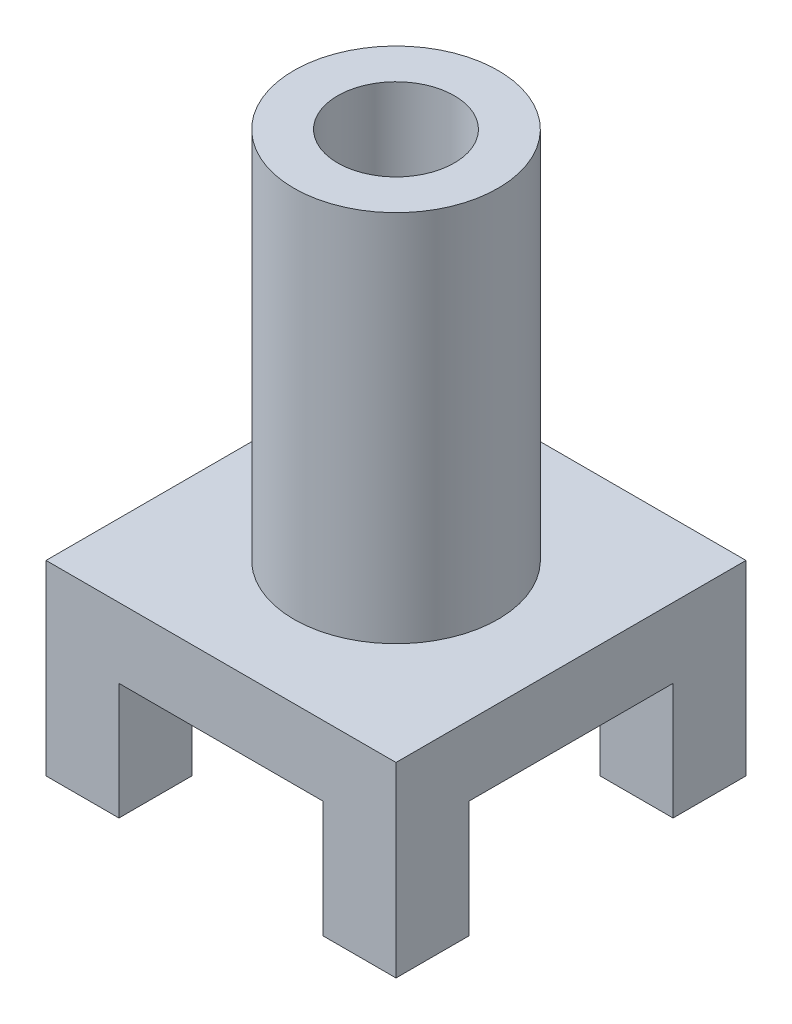
ISO-10303-21;
HEADER;
FILE_DESCRIPTION(('STEP AP214'),'2;1');
FILE_NAME('part.step','',(''),(''),'','','');
FILE_SCHEMA(('AUTOMOTIVE_DESIGN { 1 0 10303 214 1 1 1 1 }'));
ENDSEC;
DATA;
#1=APPLICATION_CONTEXT('core data for automotive mechanical design processes');
#2=APPLICATION_PROTOCOL_DEFINITION('international standard','automotive_design',2000,#1);
#3=PRODUCT_CONTEXT('',#1,'mechanical');
#4=PRODUCT('Part','Part','',(#3));
#5=PRODUCT_RELATED_PRODUCT_CATEGORY('part','',(#4));
#6=PRODUCT_DEFINITION_FORMATION('','',#4);
#7=PRODUCT_DEFINITION_CONTEXT('part definition',#1,'design');
#8=PRODUCT_DEFINITION('design','',#6,#7);
#9=PRODUCT_DEFINITION_SHAPE('','',#8);
#10=(LENGTH_UNIT() NAMED_UNIT(*) SI_UNIT(.MILLI.,.METRE.));
#11=(NAMED_UNIT(*) PLANE_ANGLE_UNIT() SI_UNIT($,.RADIAN.));
#12=(NAMED_UNIT(*) SI_UNIT($,.STERADIAN.) SOLID_ANGLE_UNIT());
#13=UNCERTAINTY_MEASURE_WITH_UNIT(LENGTH_MEASURE(1.E-05),#10,'distance_accuracy_value','');
#14=(GEOMETRIC_REPRESENTATION_CONTEXT(3) GLOBAL_UNCERTAINTY_ASSIGNED_CONTEXT((#13)) GLOBAL_UNIT_ASSIGNED_CONTEXT((#10,
#11,#12)) REPRESENTATION_CONTEXT('',''));
#15=CARTESIAN_POINT('',(0.,0.,0.));
#16=DIRECTION('',(0.,0.,1.));
#17=DIRECTION('',(1.,0.,0.));
#18=AXIS2_PLACEMENT_3D('',#15,#16,#17);
#19=CARTESIAN_POINT('',(0.,0.,0.));
#20=DIRECTION('',(0.,1.,0.));
#21=DIRECTION('',(0.,0.,1.));
#22=AXIS2_PLACEMENT_3D('',#19,#20,#21);
#23=PLANE('',#22);
#24=DIRECTION('',(1.,0.,0.));
#25=VECTOR('',#24,1.);
#26=CARTESIAN_POINT('',(-30.,0.,17.5));
#27=LINE('',#26,#25);
#28=CARTESIAN_POINT('',(-30.,0.,17.5));
#29=VERTEX_POINT('',#28);
#30=CARTESIAN_POINT('',(-17.5,0.,17.5));
#31=VERTEX_POINT('',#30);
#32=EDGE_CURVE('E224',#29,#31,#27,.T.);
#33=ORIENTED_EDGE('',*,*,#32,.T.);
#34=DIRECTION('',(0.,0.,1.));
#35=VECTOR('',#34,1.);
#36=CARTESIAN_POINT('',(-17.5,0.,-30.));
#37=LINE('',#36,#35);
#38=CARTESIAN_POINT('',(-17.5,0.,30.));
#39=VERTEX_POINT('',#38);
#40=EDGE_CURVE('E159',#31,#39,#37,.T.);
#41=ORIENTED_EDGE('',*,*,#40,.T.);
#42=DIRECTION('',(-1.,0.,0.));
#43=VECTOR('',#42,1.);
#44=CARTESIAN_POINT('',(30.,0.,30.));
#45=LINE('',#44,#43);
#46=CARTESIAN_POINT('',(-30.,0.,30.));
#47=VERTEX_POINT('',#46);
#48=EDGE_CURVE('E237',#39,#47,#45,.T.);
#49=ORIENTED_EDGE('',*,*,#48,.T.);
#50=DIRECTION('',(0.,0.,1.));
#51=VECTOR('',#50,1.);
#52=CARTESIAN_POINT('',(-30.,0.,-30.));
#53=LINE('',#52,#51);
#54=EDGE_CURVE('E180',#29,#47,#53,.T.);
#55=ORIENTED_EDGE('',*,*,#54,.F.);
#56=EDGE_LOOP('',(#33,#41,#49,#55));
#57=FACE_BOUND('',#56,.T.);
#58=ADVANCED_FACE('F34',(#57),#23,.F.);
#59=DIRECTION('',(-1.,0.,0.));
#60=VECTOR('',#59,1.);
#61=CARTESIAN_POINT('',(30.,0.,-30.));
#62=LINE('',#61,#60);
#63=CARTESIAN_POINT('',(-17.5,0.,-30.));
#64=VERTEX_POINT('',#63);
#65=CARTESIAN_POINT('',(-30.,0.,-30.));
#66=VERTEX_POINT('',#65);
#67=EDGE_CURVE('E164',#64,#66,#62,.T.);
#68=ORIENTED_EDGE('',*,*,#67,.F.);
#69=CARTESIAN_POINT('',(-17.5,0.,-17.5));
#70=VERTEX_POINT('',#69);
#71=EDGE_CURVE('E148',#64,#70,#37,.T.);
#72=ORIENTED_EDGE('',*,*,#71,.T.);
#73=DIRECTION('',(1.,0.,0.));
#74=VECTOR('',#73,1.);
#75=CARTESIAN_POINT('',(-30.,0.,-17.5));
#76=LINE('',#75,#74);
#77=CARTESIAN_POINT('',(-30.,0.,-17.5));
#78=VERTEX_POINT('',#77);
#79=EDGE_CURVE('E207',#78,#70,#76,.T.);
#80=ORIENTED_EDGE('',*,*,#79,.F.);
#81=EDGE_CURVE('E175',#66,#78,#53,.T.);
#82=ORIENTED_EDGE('',*,*,#81,.F.);
#83=EDGE_LOOP('',(#68,#72,#80,#82));
#84=FACE_BOUND('',#83,.T.);
#85=ADVANCED_FACE('F173',(#84),#23,.F.);
#86=CARTESIAN_POINT('',(-30.,0.,17.5));
#87=DIRECTION('',(0.,0.,1.));
#88=DIRECTION('',(1.,0.,0.));
#89=AXIS2_PLACEMENT_3D('',#86,#87,#88);
#90=PLANE('',#89);
#91=DIRECTION('',(1.,0.,0.));
#92=VECTOR('',#91,1.);
#93=CARTESIAN_POINT('',(-30.,20.,17.5));
#94=LINE('',#93,#92);
#95=CARTESIAN_POINT('',(-30.,20.,17.5));
#96=VERTEX_POINT('',#95);
#97=CARTESIAN_POINT('',(-17.5,20.,17.5));
#98=VERTEX_POINT('',#97);
#99=EDGE_CURVE('E218',#96,#98,#94,.T.);
#100=ORIENTED_EDGE('',*,*,#99,.T.);
#101=DIRECTION('',(0.,-1.,0.));
#102=VECTOR('',#101,1.);
#103=CARTESIAN_POINT('',(-17.5,0.,17.5));
#104=LINE('',#103,#102);
#105=EDGE_CURVE('E251',#98,#31,#104,.T.);
#106=ORIENTED_EDGE('',*,*,#105,.T.);
#107=ORIENTED_EDGE('',*,*,#32,.F.);
#108=DIRECTION('',(0.,-1.,0.));
#109=VECTOR('',#108,1.);
#110=CARTESIAN_POINT('',(-30.,0.,17.5));
#111=LINE('',#110,#109);
#112=EDGE_CURVE('E253',#96,#29,#111,.T.);
#113=ORIENTED_EDGE('',*,*,#112,.F.);
#114=EDGE_LOOP('',(#100,#106,#107,#113));
#115=FACE_BOUND('',#114,.T.);
#116=ADVANCED_FACE('F250',(#115),#90,.F.);
#117=CARTESIAN_POINT('',(-30.,0.,-17.5));
#118=DIRECTION('',(0.,0.,-1.));
#119=DIRECTION('',(-1.,0.,0.));
#120=AXIS2_PLACEMENT_3D('',#117,#118,#119);
#121=PLANE('',#120);
#122=ORIENTED_EDGE('',*,*,#79,.T.);
#123=DIRECTION('',(0.,1.,0.));
#124=VECTOR('',#123,1.);
#125=CARTESIAN_POINT('',(-17.5,0.,-17.5));
#126=LINE('',#125,#124);
#127=CARTESIAN_POINT('',(-17.5,20.,-17.5));
#128=VERTEX_POINT('',#127);
#129=EDGE_CURVE('E38',#70,#128,#126,.T.);
#130=ORIENTED_EDGE('',*,*,#129,.T.);
#131=DIRECTION('',(1.,0.,0.));
#132=VECTOR('',#131,1.);
#133=CARTESIAN_POINT('',(-30.,20.,-17.5));
#134=LINE('',#133,#132);
#135=CARTESIAN_POINT('',(-30.,20.,-17.5));
#136=VERTEX_POINT('',#135);
#137=EDGE_CURVE('E205',#136,#128,#134,.T.);
#138=ORIENTED_EDGE('',*,*,#137,.F.);
#139=DIRECTION('',(0.,1.,0.));
#140=VECTOR('',#139,1.);
#141=CARTESIAN_POINT('',(-30.,0.,-17.5));
#142=LINE('',#141,#140);
#143=EDGE_CURVE('E273',#78,#136,#142,.T.);
#144=ORIENTED_EDGE('',*,*,#143,.F.);
#145=EDGE_LOOP('',(#122,#130,#138,#144));
#146=FACE_BOUND('',#145,.T.);
#147=ADVANCED_FACE('F204',(#146),#121,.F.);
#148=CARTESIAN_POINT('',(30.,0.,30.));
#149=VERTEX_POINT('',#148);
#150=CARTESIAN_POINT('',(17.5,0.,30.));
#151=VERTEX_POINT('',#150);
#152=EDGE_CURVE('E235',#149,#151,#45,.T.);
#153=ORIENTED_EDGE('',*,*,#152,.T.);
#154=DIRECTION('',(0.,0.,1.));
#155=VECTOR('',#154,1.);
#156=CARTESIAN_POINT('',(17.5,0.,-30.));
#157=LINE('',#156,#155);
#158=CARTESIAN_POINT('',(17.5,0.,17.5));
#159=VERTEX_POINT('',#158);
#160=EDGE_CURVE('E158',#159,#151,#157,.T.);
#161=ORIENTED_EDGE('',*,*,#160,.F.);
#162=CARTESIAN_POINT('',(30.,0.,17.5));
#163=VERTEX_POINT('',#162);
#164=EDGE_CURVE('E227',#159,#163,#27,.T.);
#165=ORIENTED_EDGE('',*,*,#164,.T.);
#166=DIRECTION('',(0.,0.,1.));
#167=VECTOR('',#166,1.);
#168=CARTESIAN_POINT('',(30.,0.,-30.));
#169=LINE('',#168,#167);
#170=EDGE_CURVE('E179',#163,#149,#169,.T.);
#171=ORIENTED_EDGE('',*,*,#170,.T.);
#172=EDGE_LOOP('',(#153,#161,#165,#171));
#173=FACE_BOUND('',#172,.T.);
#174=ADVANCED_FACE('F293',(#173),#23,.F.);
#175=CARTESIAN_POINT('',(30.,32.,30.));
#176=DIRECTION('',(0.,0.,1.));
#177=DIRECTION('',(1.,0.,0.));
#178=AXIS2_PLACEMENT_3D('',#175,#176,#177);
#179=PLANE('',#178);
#180=DIRECTION('',(0.,-1.,0.));
#181=VECTOR('',#180,1.);
#182=CARTESIAN_POINT('',(-17.5,0.,30.));
#183=LINE('',#182,#181);
#184=CARTESIAN_POINT('',(-17.5,20.,30.));
#185=VERTEX_POINT('',#184);
#186=EDGE_CURVE('E298',#185,#39,#183,.T.);
#187=ORIENTED_EDGE('',*,*,#186,.F.);
#188=DIRECTION('',(-1.,0.,0.));
#189=VECTOR('',#188,1.);
#190=CARTESIAN_POINT('',(-17.5,20.,30.));
#191=LINE('',#190,#189);
#192=CARTESIAN_POINT('',(17.5,20.,30.));
#193=VERTEX_POINT('',#192);
#194=EDGE_CURVE('E170',#193,#185,#191,.T.);
#195=ORIENTED_EDGE('',*,*,#194,.F.);
#196=DIRECTION('',(0.,1.,0.));
#197=VECTOR('',#196,1.);
#198=CARTESIAN_POINT('',(17.5,0.,30.));
#199=LINE('',#198,#197);
#200=EDGE_CURVE('E297',#151,#193,#199,.T.);
#201=ORIENTED_EDGE('',*,*,#200,.F.);
#202=ORIENTED_EDGE('',*,*,#152,.F.);
#203=DIRECTION('',(0.,-1.,0.));
#204=VECTOR('',#203,1.);
#205=CARTESIAN_POINT('',(30.,32.,30.));
#206=LINE('',#205,#204);
#207=CARTESIAN_POINT('',(30.,32.,30.));
#208=VERTEX_POINT('',#207);
#209=EDGE_CURVE('E188',#208,#149,#206,.T.);
#210=ORIENTED_EDGE('',*,*,#209,.F.);
#211=DIRECTION('',(-1.,0.,0.));
#212=VECTOR('',#211,1.);
#213=CARTESIAN_POINT('',(30.,32.,30.));
#214=LINE('',#213,#212);
#215=CARTESIAN_POINT('',(-30.,32.,30.));
#216=VERTEX_POINT('',#215);
#217=EDGE_CURVE('E187',#208,#216,#214,.T.);
#218=ORIENTED_EDGE('',*,*,#217,.T.);
#219=DIRECTION('',(0.,-1.,0.));
#220=VECTOR('',#219,1.);
#221=CARTESIAN_POINT('',(-30.,32.,30.));
#222=LINE('',#221,#220);
#223=EDGE_CURVE('E196',#216,#47,#222,.T.);
#224=ORIENTED_EDGE('',*,*,#223,.T.);
#225=ORIENTED_EDGE('',*,*,#48,.F.);
#226=EDGE_LOOP('',(#187,#195,#201,#202,#210,#218,#224,#225));
#227=FACE_BOUND('',#226,.T.);
#228=ADVANCED_FACE('F36',(#227),#179,.T.);
#229=CARTESIAN_POINT('',(30.,32.,-30.));
#230=DIRECTION('',(1.,0.,0.));
#231=DIRECTION('',(0.,0.,-1.));
#232=AXIS2_PLACEMENT_3D('',#229,#230,#231);
#233=PLANE('',#232);
#234=DIRECTION('',(0.,-1.,0.));
#235=VECTOR('',#234,1.);
#236=CARTESIAN_POINT('',(30.,0.,17.5));
#237=LINE('',#236,#235);
#238=CARTESIAN_POINT('',(30.,20.,17.5));
#239=VERTEX_POINT('',#238);
#240=EDGE_CURVE('E271',#239,#163,#237,.T.);
#241=ORIENTED_EDGE('',*,*,#240,.F.);
#242=DIRECTION('',(0.,0.,1.));
#243=VECTOR('',#242,1.);
#244=CARTESIAN_POINT('',(30.,20.,17.5));
#245=LINE('',#244,#243);
#246=CARTESIAN_POINT('',(30.,20.,-17.5));
#247=VERTEX_POINT('',#246);
#248=EDGE_CURVE('E274',#247,#239,#245,.T.);
#249=ORIENTED_EDGE('',*,*,#248,.F.);
#250=DIRECTION('',(0.,1.,0.));
#251=VECTOR('',#250,1.);
#252=CARTESIAN_POINT('',(30.,0.,-17.5));
#253=LINE('',#252,#251);
#254=CARTESIAN_POINT('',(30.,0.,-17.5));
#255=VERTEX_POINT('',#254);
#256=EDGE_CURVE('E279',#255,#247,#253,.T.);
#257=ORIENTED_EDGE('',*,*,#256,.F.);
#258=CARTESIAN_POINT('',(30.,0.,-30.));
#259=VERTEX_POINT('',#258);
#260=EDGE_CURVE('E184',#259,#255,#169,.T.);
#261=ORIENTED_EDGE('',*,*,#260,.F.);
#262=DIRECTION('',(0.,-1.,0.));
#263=VECTOR('',#262,1.);
#264=CARTESIAN_POINT('',(30.,32.,-30.));
#265=LINE('',#264,#263);
#266=CARTESIAN_POINT('',(30.,32.,-30.));
#267=VERTEX_POINT('',#266);
#268=EDGE_CURVE('E192',#267,#259,#265,.T.);
#269=ORIENTED_EDGE('',*,*,#268,.F.);
#270=DIRECTION('',(0.,0.,1.));
#271=VECTOR('',#270,1.);
#272=CARTESIAN_POINT('',(30.,32.,-30.));
#273=LINE('',#272,#271);
#274=EDGE_CURVE('E198',#267,#208,#273,.T.);
#275=ORIENTED_EDGE('',*,*,#274,.T.);
#276=ORIENTED_EDGE('',*,*,#209,.T.);
#277=ORIENTED_EDGE('',*,*,#170,.F.);
#278=EDGE_LOOP('',(#241,#249,#257,#261,#269,#275,#276,#277));
#279=FACE_BOUND('',#278,.T.);
#280=ADVANCED_FACE('F287',(#279),#233,.T.);
#281=CARTESIAN_POINT('',(30.,32.,-30.));
#282=DIRECTION('',(0.,0.,1.));
#283=DIRECTION('',(1.,0.,0.));
#284=AXIS2_PLACEMENT_3D('',#281,#282,#283);
#285=PLANE('',#284);
#286=DIRECTION('',(-1.,0.,0.));
#287=VECTOR('',#286,1.);
#288=CARTESIAN_POINT('',(-17.5,20.,-30.));
#289=LINE('',#288,#287);
#290=CARTESIAN_POINT('',(17.5,20.,-30.));
#291=VERTEX_POINT('',#290);
#292=CARTESIAN_POINT('',(-17.5,20.,-30.));
#293=VERTEX_POINT('',#292);
#294=EDGE_CURVE('E168',#291,#293,#289,.T.);
#295=ORIENTED_EDGE('',*,*,#294,.T.);
#296=DIRECTION('',(0.,-1.,0.));
#297=VECTOR('',#296,1.);
#298=CARTESIAN_POINT('',(-17.5,0.,-30.));
#299=LINE('',#298,#297);
#300=EDGE_CURVE('E151',#293,#64,#299,.T.);
#301=ORIENTED_EDGE('',*,*,#300,.T.);
#302=ORIENTED_EDGE('',*,*,#67,.T.);
#303=DIRECTION('',(0.,-1.,0.));
#304=VECTOR('',#303,1.);
#305=CARTESIAN_POINT('',(-30.,32.,-30.));
#306=LINE('',#305,#304);
#307=CARTESIAN_POINT('',(-30.,32.,-30.));
#308=VERTEX_POINT('',#307);
#309=EDGE_CURVE('E194',#308,#66,#306,.T.);
#310=ORIENTED_EDGE('',*,*,#309,.F.);
#311=DIRECTION('',(-1.,0.,0.));
#312=VECTOR('',#311,1.);
#313=CARTESIAN_POINT('',(30.,32.,-30.));
#314=LINE('',#313,#312);
#315=EDGE_CURVE('E232',#267,#308,#314,.T.);
#316=ORIENTED_EDGE('',*,*,#315,.F.);
#317=ORIENTED_EDGE('',*,*,#268,.T.);
#318=CARTESIAN_POINT('',(17.5,0.,-30.));
#319=VERTEX_POINT('',#318);
#320=EDGE_CURVE('E176',#259,#319,#62,.T.);
#321=ORIENTED_EDGE('',*,*,#320,.T.);
#322=DIRECTION('',(0.,1.,0.));
#323=VECTOR('',#322,1.);
#324=CARTESIAN_POINT('',(17.5,0.,-30.));
#325=LINE('',#324,#323);
#326=EDGE_CURVE('E169',#319,#291,#325,.T.);
#327=ORIENTED_EDGE('',*,*,#326,.T.);
#328=EDGE_LOOP('',(#295,#301,#302,#310,#316,#317,#321,#327));
#329=FACE_BOUND('',#328,.T.);
#330=ADVANCED_FACE('F162',(#329),#285,.F.);
#331=CARTESIAN_POINT('',(-30.,32.,-30.));
#332=DIRECTION('',(1.,0.,0.));
#333=DIRECTION('',(0.,0.,-1.));
#334=AXIS2_PLACEMENT_3D('',#331,#332,#333);
#335=PLANE('',#334);
#336=DIRECTION('',(0.,0.,1.));
#337=VECTOR('',#336,1.);
#338=CARTESIAN_POINT('',(-30.,20.,17.5));
#339=LINE('',#338,#337);
#340=EDGE_CURVE('E213',#136,#96,#339,.T.);
#341=ORIENTED_EDGE('',*,*,#340,.T.);
#342=ORIENTED_EDGE('',*,*,#112,.T.);
#343=ORIENTED_EDGE('',*,*,#54,.T.);
#344=ORIENTED_EDGE('',*,*,#223,.F.);
#345=DIRECTION('',(0.,0.,1.));
#346=VECTOR('',#345,1.);
#347=CARTESIAN_POINT('',(-30.,32.,-30.));
#348=LINE('',#347,#346);
#349=EDGE_CURVE('E230',#308,#216,#348,.T.);
#350=ORIENTED_EDGE('',*,*,#349,.F.);
#351=ORIENTED_EDGE('',*,*,#309,.T.);
#352=ORIENTED_EDGE('',*,*,#81,.T.);
#353=ORIENTED_EDGE('',*,*,#143,.T.);
#354=EDGE_LOOP('',(#341,#342,#343,#344,#350,#351,#352,#353));
#355=FACE_BOUND('',#354,.T.);
#356=ADVANCED_FACE('F332',(#355),#335,.F.);
#357=CARTESIAN_POINT('',(0.,32.,0.));
#358=DIRECTION('',(0.,1.,0.));
#359=DIRECTION('',(0.,0.,1.));
#360=AXIS2_PLACEMENT_3D('',#357,#358,#359);
#361=PLANE('',#360);
#362=CARTESIAN_POINT('',(0.,32.,0.));
#363=DIRECTION('',(0.,1.,0.));
#364=DIRECTION('',(0.,0.,1.));
#365=AXIS2_PLACEMENT_3D('',#362,#363,#364);
#366=CIRCLE('',#365,17.5);
#367=CARTESIAN_POINT('',(0.,32.,17.5));
#368=VERTEX_POINT('',#367);
#369=EDGE_CURVE('E11',#368,#368,#366,.T.);
#370=ORIENTED_EDGE('',*,*,#369,.F.);
#371=EDGE_LOOP('',(#370));
#372=FACE_BOUND('',#371,.T.);
#373=ORIENTED_EDGE('',*,*,#217,.F.);
#374=ORIENTED_EDGE('',*,*,#274,.F.);
#375=ORIENTED_EDGE('',*,*,#315,.T.);
#376=ORIENTED_EDGE('',*,*,#349,.T.);
#377=EDGE_LOOP('',(#373,#374,#375,#376));
#378=FACE_BOUND('',#377,.T.);
#379=ADVANCED_FACE('F328',(#372,#378),#361,.T.);
#380=CARTESIAN_POINT('',(17.5,0.,-17.5));
#381=VERTEX_POINT('',#380);
#382=EDGE_CURVE('E223',#381,#255,#76,.T.);
#383=ORIENTED_EDGE('',*,*,#382,.F.);
#384=EDGE_CURVE('E58',#319,#381,#157,.T.);
#385=ORIENTED_EDGE('',*,*,#384,.F.);
#386=ORIENTED_EDGE('',*,*,#320,.F.);
#387=ORIENTED_EDGE('',*,*,#260,.T.);
#388=EDGE_LOOP('',(#383,#385,#386,#387));
#389=FACE_BOUND('',#388,.T.);
#390=ADVANCED_FACE('F331',(#389),#23,.F.);
#391=ORIENTED_EDGE('',*,*,#164,.F.);
#392=DIRECTION('',(0.,1.,0.));
#393=VECTOR('',#392,1.);
#394=CARTESIAN_POINT('',(17.5,0.,17.5));
#395=LINE('',#394,#393);
#396=CARTESIAN_POINT('',(17.5,20.,17.5));
#397=VERTEX_POINT('',#396);
#398=EDGE_CURVE('E262',#159,#397,#395,.T.);
#399=ORIENTED_EDGE('',*,*,#398,.T.);
#400=EDGE_CURVE('E215',#397,#239,#94,.T.);
#401=ORIENTED_EDGE('',*,*,#400,.T.);
#402=ORIENTED_EDGE('',*,*,#240,.T.);
#403=EDGE_LOOP('',(#391,#399,#401,#402));
#404=FACE_BOUND('',#403,.T.);
#405=ADVANCED_FACE('F290',(#404),#90,.F.);
#406=CARTESIAN_POINT('',(-30.,20.,17.5));
#407=DIRECTION('',(0.,1.,0.));
#408=DIRECTION('',(0.,0.,1.));
#409=AXIS2_PLACEMENT_3D('',#406,#407,#408);
#410=PLANE('',#409);
#411=CARTESIAN_POINT('',(0.,20.,0.));
#412=DIRECTION('',(0.,1.,0.));
#413=DIRECTION('',(0.,0.,1.));
#414=AXIS2_PLACEMENT_3D('',#411,#412,#413);
#415=CIRCLE('',#414,10.);
#416=CARTESIAN_POINT('',(0.,20.,10.));
#417=VERTEX_POINT('',#416);
#418=EDGE_CURVE('E306',#417,#417,#415,.T.);
#419=ORIENTED_EDGE('',*,*,#418,.T.);
#420=EDGE_LOOP('',(#419));
#421=FACE_BOUND('',#420,.T.);
#422=ORIENTED_EDGE('',*,*,#400,.F.);
#423=DIRECTION('',(0.,0.,1.));
#424=VECTOR('',#423,1.);
#425=CARTESIAN_POINT('',(17.5,20.,-30.));
#426=LINE('',#425,#424);
#427=EDGE_CURVE('E50',#397,#193,#426,.T.);
#428=ORIENTED_EDGE('',*,*,#427,.T.);
#429=ORIENTED_EDGE('',*,*,#194,.T.);
#430=DIRECTION('',(0.,0.,1.));
#431=VECTOR('',#430,1.);
#432=CARTESIAN_POINT('',(-17.5,20.,-30.));
#433=LINE('',#432,#431);
#434=EDGE_CURVE('E256',#98,#185,#433,.T.);
#435=ORIENTED_EDGE('',*,*,#434,.F.);
#436=ORIENTED_EDGE('',*,*,#99,.F.);
#437=ORIENTED_EDGE('',*,*,#340,.F.);
#438=ORIENTED_EDGE('',*,*,#137,.T.);
#439=EDGE_CURVE('E211',#293,#128,#433,.T.);
#440=ORIENTED_EDGE('',*,*,#439,.F.);
#441=ORIENTED_EDGE('',*,*,#294,.F.);
#442=CARTESIAN_POINT('',(17.5,20.,-17.5));
#443=VERTEX_POINT('',#442);
#444=EDGE_CURVE('E260',#291,#443,#426,.T.);
#445=ORIENTED_EDGE('',*,*,#444,.T.);
#446=EDGE_CURVE('E216',#443,#247,#134,.T.);
#447=ORIENTED_EDGE('',*,*,#446,.T.);
#448=ORIENTED_EDGE('',*,*,#248,.T.);
#449=EDGE_LOOP('',(#422,#428,#429,#435,#436,#437,#438,#440,#441,#445,#447,#448));
#450=FACE_BOUND('',#449,.T.);
#451=ADVANCED_FACE('F210',(#421,#450),#410,.F.);
#452=ORIENTED_EDGE('',*,*,#446,.F.);
#453=DIRECTION('',(0.,-1.,0.));
#454=VECTOR('',#453,1.);
#455=CARTESIAN_POINT('',(17.5,0.,-17.5));
#456=LINE('',#455,#454);
#457=EDGE_CURVE('E191',#443,#381,#456,.T.);
#458=ORIENTED_EDGE('',*,*,#457,.T.);
#459=ORIENTED_EDGE('',*,*,#382,.T.);
#460=ORIENTED_EDGE('',*,*,#256,.T.);
#461=EDGE_LOOP('',(#452,#458,#459,#460));
#462=FACE_BOUND('',#461,.T.);
#463=ADVANCED_FACE('F365',(#462),#121,.F.);
#464=CARTESIAN_POINT('',(17.5,0.,-30.));
#465=DIRECTION('',(1.,0.,0.));
#466=DIRECTION('',(0.,0.,-1.));
#467=AXIS2_PLACEMENT_3D('',#464,#465,#466);
#468=PLANE('',#467);
#469=ORIENTED_EDGE('',*,*,#444,.F.);
#470=ORIENTED_EDGE('',*,*,#326,.F.);
#471=ORIENTED_EDGE('',*,*,#384,.T.);
#472=ORIENTED_EDGE('',*,*,#457,.F.);
#473=EDGE_LOOP('',(#469,#470,#471,#472));
#474=FACE_BOUND('',#473,.T.);
#475=ADVANCED_FACE('F345',(#474),#468,.F.);
#476=CARTESIAN_POINT('',(-17.5,0.,-30.));
#477=DIRECTION('',(-1.,0.,0.));
#478=DIRECTION('',(0.,0.,1.));
#479=AXIS2_PLACEMENT_3D('',#476,#477,#478);
#480=PLANE('',#479);
#481=ORIENTED_EDGE('',*,*,#71,.F.);
#482=ORIENTED_EDGE('',*,*,#300,.F.);
#483=ORIENTED_EDGE('',*,*,#439,.T.);
#484=ORIENTED_EDGE('',*,*,#129,.F.);
#485=EDGE_LOOP('',(#481,#482,#483,#484));
#486=FACE_BOUND('',#485,.T.);
#487=ADVANCED_FACE('F150',(#486),#480,.F.);
#488=ORIENTED_EDGE('',*,*,#434,.T.);
#489=ORIENTED_EDGE('',*,*,#186,.T.);
#490=ORIENTED_EDGE('',*,*,#40,.F.);
#491=ORIENTED_EDGE('',*,*,#105,.F.);
#492=EDGE_LOOP('',(#488,#489,#490,#491));
#493=FACE_BOUND('',#492,.T.);
#494=ADVANCED_FACE('F337',(#493),#480,.F.);
#495=ORIENTED_EDGE('',*,*,#160,.T.);
#496=ORIENTED_EDGE('',*,*,#200,.T.);
#497=ORIENTED_EDGE('',*,*,#427,.F.);
#498=ORIENTED_EDGE('',*,*,#398,.F.);
#499=EDGE_LOOP('',(#495,#496,#497,#498));
#500=FACE_BOUND('',#499,.T.);
#501=ADVANCED_FACE('F291',(#500),#468,.F.);
#502=CARTESIAN_POINT('',(0.,96.,0.));
#503=DIRECTION('',(0.,-1.,0.));
#504=DIRECTION('',(0.,0.,-1.));
#505=AXIS2_PLACEMENT_3D('',#502,#503,#504);
#506=CYLINDRICAL_SURFACE('',#505,17.5);
#507=CARTESIAN_POINT('',(0.,96.,0.));
#508=DIRECTION('',(0.,1.,0.));
#509=DIRECTION('',(0.,0.,1.));
#510=AXIS2_PLACEMENT_3D('',#507,#508,#509);
#511=CIRCLE('',#510,17.5);
#512=CARTESIAN_POINT('',(0.,96.,17.5));
#513=VERTEX_POINT('',#512);
#514=EDGE_CURVE('E299',#513,#513,#511,.T.);
#515=ORIENTED_EDGE('',*,*,#514,.F.);
#516=EDGE_LOOP('',(#515));
#517=FACE_BOUND('',#516,.T.);
#518=ORIENTED_EDGE('',*,*,#369,.T.);
#519=EDGE_LOOP('',(#518));
#520=FACE_BOUND('',#519,.T.);
#521=ADVANCED_FACE('F319',(#517,#520),#506,.T.);
#522=CARTESIAN_POINT('',(0.,96.,0.));
#523=DIRECTION('',(0.,1.,0.));
#524=DIRECTION('',(0.,0.,1.));
#525=AXIS2_PLACEMENT_3D('',#522,#523,#524);
#526=PLANE('',#525);
#527=CARTESIAN_POINT('',(0.,96.,0.));
#528=DIRECTION('',(0.,1.,0.));
#529=DIRECTION('',(0.,0.,1.));
#530=AXIS2_PLACEMENT_3D('',#527,#528,#529);
#531=CIRCLE('',#530,10.);
#532=CARTESIAN_POINT('',(0.,96.,10.));
#533=VERTEX_POINT('',#532);
#534=EDGE_CURVE('E309',#533,#533,#531,.T.);
#535=ORIENTED_EDGE('',*,*,#534,.F.);
#536=EDGE_LOOP('',(#535));
#537=FACE_BOUND('',#536,.T.);
#538=ORIENTED_EDGE('',*,*,#514,.T.);
#539=EDGE_LOOP('',(#538));
#540=FACE_BOUND('',#539,.T.);
#541=ADVANCED_FACE('F316',(#537,#540),#526,.T.);
#542=CARTESIAN_POINT('',(0.,0.,0.));
#543=DIRECTION('',(0.,1.,0.));
#544=DIRECTION('',(0.,0.,1.));
#545=AXIS2_PLACEMENT_3D('',#542,#543,#544);
#546=CYLINDRICAL_SURFACE('',#545,10.);
#547=ORIENTED_EDGE('',*,*,#534,.T.);
#548=EDGE_LOOP('',(#547));
#549=FACE_BOUND('',#548,.T.);
#550=ORIENTED_EDGE('',*,*,#418,.F.);
#551=EDGE_LOOP('',(#550));
#552=FACE_BOUND('',#551,.T.);
#553=ADVANCED_FACE('F313',(#549,#552),#546,.F.);
#554=CLOSED_SHELL('',(#58,#85,#116,#147,#174,#228,#280,#330,#356,#379,#390,#405,#451,#463,#475,
#487,#494,#501,#521,#541,#553));
#555=MANIFOLD_SOLID_BREP('B2',#554);
#556=ADVANCED_BREP_SHAPE_REPRESENTATION('',(#18,#555),#14);
#557=SHAPE_DEFINITION_REPRESENTATION(#9,#556);
ENDSEC;
END-ISO-10303-21;
